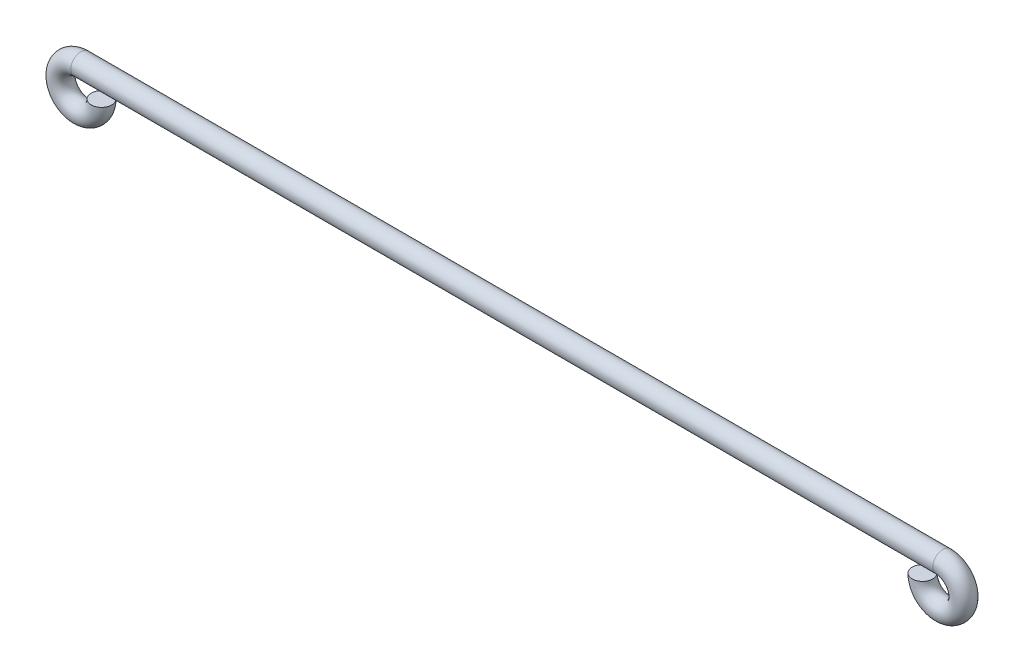
ISO-10303-21;
HEADER;
FILE_DESCRIPTION(('STEP AP214'),'2;1');
FILE_NAME('part.step','',(''),(''),'','','');
FILE_SCHEMA(('AUTOMOTIVE_DESIGN { 1 0 10303 214 1 1 1 1 }'));
ENDSEC;
DATA;
#1=APPLICATION_CONTEXT('core data for automotive mechanical design processes');
#2=APPLICATION_PROTOCOL_DEFINITION('international standard','automotive_design',2000,#1);
#3=PRODUCT_CONTEXT('',#1,'mechanical');
#4=PRODUCT('Part','Part','',(#3));
#5=PRODUCT_RELATED_PRODUCT_CATEGORY('part','',(#4));
#6=PRODUCT_DEFINITION_FORMATION('','',#4);
#7=PRODUCT_DEFINITION_CONTEXT('part definition',#1,'design');
#8=PRODUCT_DEFINITION('design','',#6,#7);
#9=PRODUCT_DEFINITION_SHAPE('','',#8);
#10=(LENGTH_UNIT() NAMED_UNIT(*) SI_UNIT(.MILLI.,.METRE.));
#11=(NAMED_UNIT(*) PLANE_ANGLE_UNIT() SI_UNIT($,.RADIAN.));
#12=(NAMED_UNIT(*) SI_UNIT($,.STERADIAN.) SOLID_ANGLE_UNIT());
#13=UNCERTAINTY_MEASURE_WITH_UNIT(LENGTH_MEASURE(1.E-05),#10,'distance_accuracy_value','');
#14=(GEOMETRIC_REPRESENTATION_CONTEXT(3) GLOBAL_UNCERTAINTY_ASSIGNED_CONTEXT((#13)) GLOBAL_UNIT_ASSIGNED_CONTEXT((#10,
#11,#12)) REPRESENTATION_CONTEXT('',''));
#15=CARTESIAN_POINT('',(0.,0.,0.));
#16=DIRECTION('',(0.,0.,1.));
#17=DIRECTION('',(1.,0.,0.));
#18=AXIS2_PLACEMENT_3D('',#15,#16,#17);
#19=CARTESIAN_POINT('',(41.,0.,0.));
#20=DIRECTION('',(0.,0.,-1.));
#21=DIRECTION('',(-1.,0.,0.));
#22=AXIS2_PLACEMENT_3D('',#19,#20,#21);
#23=TOROIDAL_SURFACE('',#22,1.,0.5);
#24=CARTESIAN_POINT('',(41.,1.00000000000001,0.));
#25=DIRECTION('',(-1.,0.,0.));
#26=DIRECTION('',(0.,0.,1.));
#27=AXIS2_PLACEMENT_3D('',#24,#25,#26);
#28=CIRCLE('',#27,0.5);
#29=CARTESIAN_POINT('',(41.,1.50000000000001,0.));
#30=VERTEX_POINT('',#29);
#31=EDGE_CURVE('E40',#30,#30,#28,.T.);
#32=CARTESIAN_POINT('',(40.,0.,0.));
#33=DIRECTION('',(0.,-1.,0.));
#34=DIRECTION('',(0.,0.,1.));
#35=AXIS2_PLACEMENT_3D('',#32,#33,#34);
#36=CIRCLE('',#35,0.5);
#37=CARTESIAN_POINT('',(39.5,0.,0.));
#38=VERTEX_POINT('',#37);
#39=EDGE_CURVE('E10',#38,#38,#36,.T.);
#40=CARTESIAN_POINT('',(41.,0.,0.));
#41=DIRECTION('',(0.,0.,-1.));
#42=DIRECTION('',(-1.,0.,0.));
#43=AXIS2_PLACEMENT_3D('',#40,#41,#42);
#44=CIRCLE('',#43,1.5);
#45=EDGE_CURVE('',#30,#38,#44,.T.);
#46=ORIENTED_EDGE('',*,*,#31,.F.);
#47=ORIENTED_EDGE('',*,*,#39,.T.);
#48=ORIENTED_EDGE('',*,*,#45,.T.);
#49=ORIENTED_EDGE('',*,*,#45,.F.);
#50=EDGE_LOOP('',(#46,#48,#47,#49));
#51=FACE_BOUND('',#50,.T.);
#52=ADVANCED_FACE('F33',(#51),#23,.T.);
#53=CARTESIAN_POINT('',(-0.999999999999986,1.,0.));
#54=DIRECTION('',(1.,0.,0.));
#55=DIRECTION('',(0.,1.,0.));
#56=AXIS2_PLACEMENT_3D('',#53,#54,#55);
#57=CYLINDRICAL_SURFACE('',#56,0.5);
#58=CARTESIAN_POINT('',(-0.999999999999986,1.,0.));
#59=DIRECTION('',(-1.,0.,0.));
#60=DIRECTION('',(0.,0.,1.));
#61=AXIS2_PLACEMENT_3D('',#58,#59,#60);
#62=CIRCLE('',#61,0.5);
#63=CARTESIAN_POINT('',(-0.99999999999998,1.5,0.));
#64=VERTEX_POINT('',#63);
#65=EDGE_CURVE('E45',#64,#64,#62,.T.);
#66=ORIENTED_EDGE('',*,*,#65,.F.);
#67=EDGE_LOOP('',(#66));
#68=FACE_BOUND('',#67,.T.);
#69=ORIENTED_EDGE('',*,*,#31,.T.);
#70=EDGE_LOOP('',(#69));
#71=FACE_BOUND('',#70,.T.);
#72=ADVANCED_FACE('F60',(#68,#71),#57,.T.);
#73=CARTESIAN_POINT('',(-1.,0.,0.));
#74=DIRECTION('',(0.,0.,1.));
#75=DIRECTION('',(1.,0.,0.));
#76=AXIS2_PLACEMENT_3D('',#73,#74,#75);
#77=TOROIDAL_SURFACE('',#76,1.,0.5);
#78=CARTESIAN_POINT('',(0.,0.,0.));
#79=DIRECTION('',(0.,1.,0.));
#80=DIRECTION('',(0.,0.,1.));
#81=AXIS2_PLACEMENT_3D('',#78,#79,#80);
#82=CIRCLE('',#81,0.5);
#83=CARTESIAN_POINT('',(0.5,0.,0.));
#84=VERTEX_POINT('',#83);
#85=EDGE_CURVE('E49',#84,#84,#82,.T.);
#86=CARTESIAN_POINT('',(-1.,0.,0.));
#87=DIRECTION('',(0.,0.,1.));
#88=DIRECTION('',(1.,0.,0.));
#89=AXIS2_PLACEMENT_3D('',#86,#87,#88);
#90=CIRCLE('',#89,1.5);
#91=EDGE_CURVE('',#64,#84,#90,.T.);
#92=ORIENTED_EDGE('',*,*,#65,.T.);
#93=ORIENTED_EDGE('',*,*,#85,.F.);
#94=ORIENTED_EDGE('',*,*,#91,.T.);
#95=ORIENTED_EDGE('',*,*,#91,.F.);
#96=EDGE_LOOP('',(#92,#94,#93,#95));
#97=FACE_BOUND('',#96,.T.);
#98=ADVANCED_FACE('F57',(#97),#77,.T.);
#99=CARTESIAN_POINT('',(40.,0.,0.));
#100=DIRECTION('',(0.,-1.,0.));
#101=DIRECTION('',(0.,0.,1.));
#102=AXIS2_PLACEMENT_3D('',#99,#100,#101);
#103=PLANE('',#102);
#104=ORIENTED_EDGE('',*,*,#39,.F.);
#105=EDGE_LOOP('',(#104));
#106=FACE_BOUND('',#105,.T.);
#107=ADVANCED_FACE('F59',(#106),#103,.F.);
#108=CARTESIAN_POINT('',(0.,0.,0.));
#109=DIRECTION('',(0.,1.,0.));
#110=DIRECTION('',(0.,0.,1.));
#111=AXIS2_PLACEMENT_3D('',#108,#109,#110);
#112=PLANE('',#111);
#113=ORIENTED_EDGE('',*,*,#85,.T.);
#114=EDGE_LOOP('',(#113));
#115=FACE_BOUND('',#114,.T.);
#116=ADVANCED_FACE('F55',(#115),#112,.T.);
#117=CLOSED_SHELL('',(#52,#72,#98,#107,#116));
#118=MANIFOLD_SOLID_BREP('B2',#117);
#119=ADVANCED_BREP_SHAPE_REPRESENTATION('',(#18,#118),#14);
#120=SHAPE_DEFINITION_REPRESENTATION(#9,#119);
ENDSEC;
END-ISO-10303-21;
